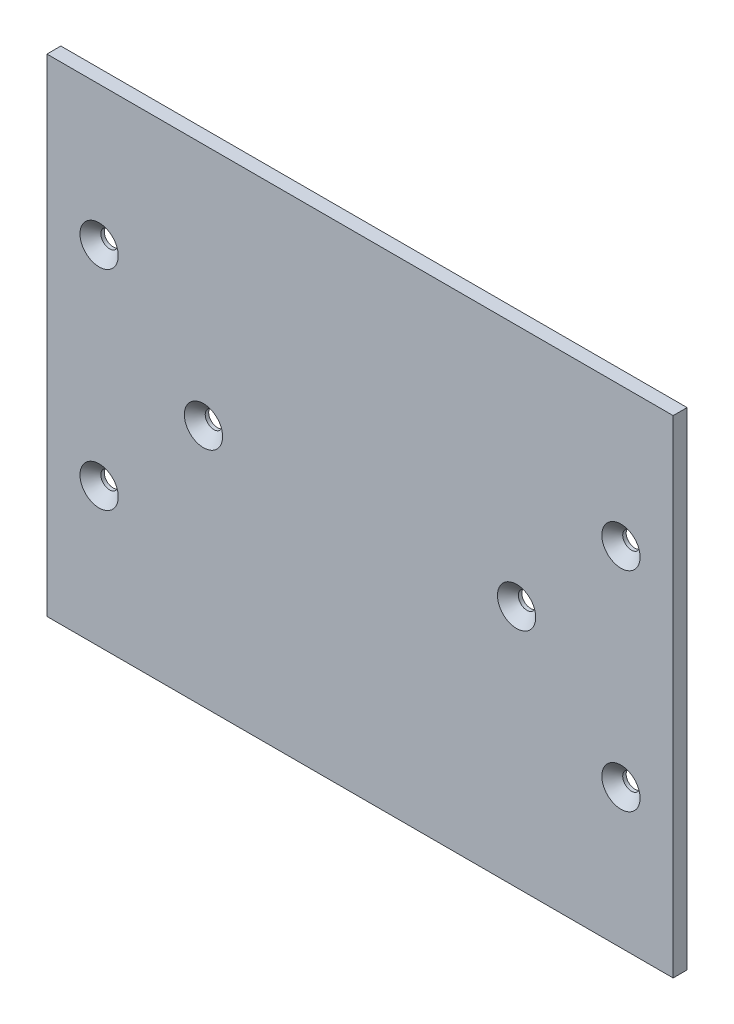
ISO-10303-21;
HEADER;
FILE_DESCRIPTION(('STEP AP214'),'2;1');
FILE_NAME('part.step','',(''),(''),'','','');
FILE_SCHEMA(('AUTOMOTIVE_DESIGN { 1 0 10303 214 1 1 1 1 }'));
ENDSEC;
DATA;
#1=APPLICATION_CONTEXT('core data for automotive mechanical design processes');
#2=APPLICATION_PROTOCOL_DEFINITION('international standard','automotive_design',2000,#1);
#3=PRODUCT_CONTEXT('',#1,'mechanical');
#4=PRODUCT('Part','Part','',(#3));
#5=PRODUCT_RELATED_PRODUCT_CATEGORY('part','',(#4));
#6=PRODUCT_DEFINITION_FORMATION('','',#4);
#7=PRODUCT_DEFINITION_CONTEXT('part definition',#1,'design');
#8=PRODUCT_DEFINITION('design','',#6,#7);
#9=PRODUCT_DEFINITION_SHAPE('','',#8);
#10=(LENGTH_UNIT() NAMED_UNIT(*) SI_UNIT(.MILLI.,.METRE.));
#11=(NAMED_UNIT(*) PLANE_ANGLE_UNIT() SI_UNIT($,.RADIAN.));
#12=(NAMED_UNIT(*) SI_UNIT($,.STERADIAN.) SOLID_ANGLE_UNIT());
#13=UNCERTAINTY_MEASURE_WITH_UNIT(LENGTH_MEASURE(1.E-05),#10,'distance_accuracy_value','');
#14=(GEOMETRIC_REPRESENTATION_CONTEXT(3) GLOBAL_UNCERTAINTY_ASSIGNED_CONTEXT((#13)) GLOBAL_UNIT_ASSIGNED_CONTEXT((#10,
#11,#12)) REPRESENTATION_CONTEXT('',''));
#15=CARTESIAN_POINT('',(0.,0.,0.));
#16=DIRECTION('',(0.,0.,1.));
#17=DIRECTION('',(1.,0.,0.));
#18=AXIS2_PLACEMENT_3D('',#15,#16,#17);
#19=CARTESIAN_POINT('',(-90.,70.,4.));
#20=DIRECTION('',(1.,0.,0.));
#21=DIRECTION('',(0.,1.,0.));
#22=AXIS2_PLACEMENT_3D('',#19,#20,#21);
#23=PLANE('',#22);
#24=DIRECTION('',(0.,-1.,0.));
#25=VECTOR('',#24,1.);
#26=CARTESIAN_POINT('',(-90.,70.,0.));
#27=LINE('',#26,#25);
#28=CARTESIAN_POINT('',(-90.,70.,0.));
#29=VERTEX_POINT('',#28);
#30=CARTESIAN_POINT('',(-90.,-70.,0.));
#31=VERTEX_POINT('',#30);
#32=EDGE_CURVE('E107',#29,#31,#27,.T.);
#33=ORIENTED_EDGE('',*,*,#32,.T.);
#34=DIRECTION('',(0.,0.,-1.));
#35=VECTOR('',#34,1.);
#36=CARTESIAN_POINT('',(-90.,-70.,4.));
#37=LINE('',#36,#35);
#38=CARTESIAN_POINT('',(-90.,-70.,4.));
#39=VERTEX_POINT('',#38);
#40=EDGE_CURVE('E98',#39,#31,#37,.T.);
#41=ORIENTED_EDGE('',*,*,#40,.F.);
#42=DIRECTION('',(0.,-1.,0.));
#43=VECTOR('',#42,1.);
#44=CARTESIAN_POINT('',(-90.,70.,4.));
#45=LINE('',#44,#43);
#46=CARTESIAN_POINT('',(-90.,70.,4.));
#47=VERTEX_POINT('',#46);
#48=EDGE_CURVE('E92',#47,#39,#45,.T.);
#49=ORIENTED_EDGE('',*,*,#48,.F.);
#50=DIRECTION('',(0.,0.,-1.));
#51=VECTOR('',#50,1.);
#52=CARTESIAN_POINT('',(-90.,70.,4.));
#53=LINE('',#52,#51);
#54=EDGE_CURVE('E103',#47,#29,#53,.T.);
#55=ORIENTED_EDGE('',*,*,#54,.T.);
#56=EDGE_LOOP('',(#33,#41,#49,#55));
#57=FACE_BOUND('',#56,.T.);
#58=ADVANCED_FACE('F39',(#57),#23,.F.);
#59=CARTESIAN_POINT('',(-90.,-70.,4.));
#60=DIRECTION('',(0.,1.,0.));
#61=DIRECTION('',(-1.,0.,0.));
#62=AXIS2_PLACEMENT_3D('',#59,#60,#61);
#63=PLANE('',#62);
#64=DIRECTION('',(1.,0.,0.));
#65=VECTOR('',#64,1.);
#66=CARTESIAN_POINT('',(-90.,-70.,0.));
#67=LINE('',#66,#65);
#68=CARTESIAN_POINT('',(90.,-70.,0.));
#69=VERTEX_POINT('',#68);
#70=EDGE_CURVE('E97',#31,#69,#67,.T.);
#71=ORIENTED_EDGE('',*,*,#70,.T.);
#72=DIRECTION('',(0.,0.,-1.));
#73=VECTOR('',#72,1.);
#74=CARTESIAN_POINT('',(90.,-70.,4.));
#75=LINE('',#74,#73);
#76=CARTESIAN_POINT('',(90.,-70.,4.));
#77=VERTEX_POINT('',#76);
#78=EDGE_CURVE('E95',#77,#69,#75,.T.);
#79=ORIENTED_EDGE('',*,*,#78,.F.);
#80=DIRECTION('',(1.,0.,0.));
#81=VECTOR('',#80,1.);
#82=CARTESIAN_POINT('',(-90.,-70.,4.));
#83=LINE('',#82,#81);
#84=EDGE_CURVE('E87',#39,#77,#83,.T.);
#85=ORIENTED_EDGE('',*,*,#84,.F.);
#86=ORIENTED_EDGE('',*,*,#40,.T.);
#87=EDGE_LOOP('',(#71,#79,#85,#86));
#88=FACE_BOUND('',#87,.T.);
#89=ADVANCED_FACE('F96',(#88),#63,.F.);
#90=CARTESIAN_POINT('',(90.,70.,4.));
#91=DIRECTION('',(-1.,0.,0.));
#92=DIRECTION('',(0.,-1.,0.));
#93=AXIS2_PLACEMENT_3D('',#90,#91,#92);
#94=PLANE('',#93);
#95=DIRECTION('',(0.,1.,0.));
#96=VECTOR('',#95,1.);
#97=CARTESIAN_POINT('',(90.,70.,0.));
#98=LINE('',#97,#96);
#99=CARTESIAN_POINT('',(90.,70.,0.));
#100=VERTEX_POINT('',#99);
#101=EDGE_CURVE('E73',#69,#100,#98,.T.);
#102=ORIENTED_EDGE('',*,*,#101,.T.);
#103=DIRECTION('',(0.,0.,-1.));
#104=VECTOR('',#103,1.);
#105=CARTESIAN_POINT('',(90.,70.,4.));
#106=LINE('',#105,#104);
#107=CARTESIAN_POINT('',(90.,70.,4.));
#108=VERTEX_POINT('',#107);
#109=EDGE_CURVE('E99',#108,#100,#106,.T.);
#110=ORIENTED_EDGE('',*,*,#109,.F.);
#111=DIRECTION('',(0.,1.,0.));
#112=VECTOR('',#111,1.);
#113=CARTESIAN_POINT('',(90.,70.,4.));
#114=LINE('',#113,#112);
#115=EDGE_CURVE('E90',#77,#108,#114,.T.);
#116=ORIENTED_EDGE('',*,*,#115,.F.);
#117=ORIENTED_EDGE('',*,*,#78,.T.);
#118=EDGE_LOOP('',(#102,#110,#116,#117));
#119=FACE_BOUND('',#118,.T.);
#120=ADVANCED_FACE('F101',(#119),#94,.F.);
#121=CARTESIAN_POINT('',(-90.,70.,4.));
#122=DIRECTION('',(0.,-1.,0.));
#123=DIRECTION('',(1.,0.,0.));
#124=AXIS2_PLACEMENT_3D('',#121,#122,#123);
#125=PLANE('',#124);
#126=DIRECTION('',(-1.,0.,0.));
#127=VECTOR('',#126,1.);
#128=CARTESIAN_POINT('',(-90.,70.,0.));
#129=LINE('',#128,#127);
#130=EDGE_CURVE('E79',#100,#29,#129,.T.);
#131=ORIENTED_EDGE('',*,*,#130,.T.);
#132=ORIENTED_EDGE('',*,*,#54,.F.);
#133=DIRECTION('',(-1.,0.,0.));
#134=VECTOR('',#133,1.);
#135=CARTESIAN_POINT('',(-90.,70.,4.));
#136=LINE('',#135,#134);
#137=EDGE_CURVE('E56',#108,#47,#136,.T.);
#138=ORIENTED_EDGE('',*,*,#137,.F.);
#139=ORIENTED_EDGE('',*,*,#109,.T.);
#140=EDGE_LOOP('',(#131,#132,#138,#139));
#141=FACE_BOUND('',#140,.T.);
#142=ADVANCED_FACE('F161',(#141),#125,.F.);
#143=CARTESIAN_POINT('',(0.,0.,4.));
#144=DIRECTION('',(0.,0.,1.));
#145=DIRECTION('',(1.,0.,0.));
#146=AXIS2_PLACEMENT_3D('',#143,#144,#145);
#147=PLANE('',#146);
#148=CARTESIAN_POINT('',(-45.,0.,4.));
#149=DIRECTION('',(0.,0.,1.));
#150=DIRECTION('',(1.,0.,0.));
#151=AXIS2_PLACEMENT_3D('',#148,#149,#150);
#152=CIRCLE('',#151,5.50000000000003);
#153=CARTESIAN_POINT('',(-39.5,0.,4.));
#154=VERTEX_POINT('',#153);
#155=EDGE_CURVE('E132',#154,#154,#152,.F.);
#156=ORIENTED_EDGE('',*,*,#155,.T.);
#157=EDGE_LOOP('',(#156));
#158=FACE_BOUND('',#157,.T.);
#159=CARTESIAN_POINT('',(45.,0.,4.));
#160=DIRECTION('',(0.,0.,1.));
#161=DIRECTION('',(1.,0.,0.));
#162=AXIS2_PLACEMENT_3D('',#159,#160,#161);
#163=CIRCLE('',#162,5.50000000000003);
#164=CARTESIAN_POINT('',(50.5000000000001,0.,4.));
#165=VERTEX_POINT('',#164);
#166=EDGE_CURVE('E129',#165,#165,#163,.F.);
#167=ORIENTED_EDGE('',*,*,#166,.T.);
#168=EDGE_LOOP('',(#167));
#169=FACE_BOUND('',#168,.T.);
#170=CARTESIAN_POINT('',(-75.,30.,4.));
#171=DIRECTION('',(0.,0.,1.));
#172=DIRECTION('',(1.,0.,0.));
#173=AXIS2_PLACEMENT_3D('',#170,#171,#172);
#174=CIRCLE('',#173,5.50000000000003);
#175=CARTESIAN_POINT('',(-69.5,30.,4.));
#176=VERTEX_POINT('',#175);
#177=EDGE_CURVE('E126',#176,#176,#174,.F.);
#178=ORIENTED_EDGE('',*,*,#177,.T.);
#179=EDGE_LOOP('',(#178));
#180=FACE_BOUND('',#179,.T.);
#181=CARTESIAN_POINT('',(-75.,-30.,4.));
#182=DIRECTION('',(0.,0.,1.));
#183=DIRECTION('',(1.,0.,0.));
#184=AXIS2_PLACEMENT_3D('',#181,#182,#183);
#185=CIRCLE('',#184,5.50000000000003);
#186=CARTESIAN_POINT('',(-69.5,-30.,4.));
#187=VERTEX_POINT('',#186);
#188=EDGE_CURVE('E123',#187,#187,#185,.F.);
#189=ORIENTED_EDGE('',*,*,#188,.T.);
#190=EDGE_LOOP('',(#189));
#191=FACE_BOUND('',#190,.T.);
#192=CARTESIAN_POINT('',(75.,-30.,4.));
#193=DIRECTION('',(0.,0.,1.));
#194=DIRECTION('',(1.,0.,0.));
#195=AXIS2_PLACEMENT_3D('',#192,#193,#194);
#196=CIRCLE('',#195,5.50000000000003);
#197=CARTESIAN_POINT('',(80.5000000000001,-30.,4.));
#198=VERTEX_POINT('',#197);
#199=EDGE_CURVE('E120',#198,#198,#196,.F.);
#200=ORIENTED_EDGE('',*,*,#199,.T.);
#201=EDGE_LOOP('',(#200));
#202=FACE_BOUND('',#201,.T.);
#203=CARTESIAN_POINT('',(75.0000000000001,30.,4.));
#204=DIRECTION('',(0.,0.,1.));
#205=DIRECTION('',(1.,0.,0.));
#206=AXIS2_PLACEMENT_3D('',#203,#204,#205);
#207=CIRCLE('',#206,5.50000000000003);
#208=CARTESIAN_POINT('',(80.5000000000001,30.,4.));
#209=VERTEX_POINT('',#208);
#210=EDGE_CURVE('E117',#209,#209,#207,.F.);
#211=ORIENTED_EDGE('',*,*,#210,.T.);
#212=EDGE_LOOP('',(#211));
#213=FACE_BOUND('',#212,.T.);
#214=ORIENTED_EDGE('',*,*,#48,.T.);
#215=ORIENTED_EDGE('',*,*,#84,.T.);
#216=ORIENTED_EDGE('',*,*,#115,.T.);
#217=ORIENTED_EDGE('',*,*,#137,.T.);
#218=EDGE_LOOP('',(#214,#215,#216,#217));
#219=FACE_BOUND('',#218,.T.);
#220=ADVANCED_FACE('F88',(#158,#169,#180,#191,#202,#213,#219),#147,.T.);
#221=CARTESIAN_POINT('',(0.,0.,0.));
#222=DIRECTION('',(0.,0.,1.));
#223=DIRECTION('',(1.,0.,0.));
#224=AXIS2_PLACEMENT_3D('',#221,#222,#223);
#225=PLANE('',#224);
#226=CARTESIAN_POINT('',(75.,-30.,0.));
#227=DIRECTION('',(0.,0.,-1.));
#228=DIRECTION('',(-1.,0.,0.));
#229=AXIS2_PLACEMENT_3D('',#226,#227,#228);
#230=CIRCLE('',#229,2.50000000000001);
#231=CARTESIAN_POINT('',(72.5,-30.,0.));
#232=VERTEX_POINT('',#231);
#233=EDGE_CURVE('E210',#232,#232,#230,.T.);
#234=ORIENTED_EDGE('',*,*,#233,.F.);
#235=EDGE_LOOP('',(#234));
#236=FACE_BOUND('',#235,.T.);
#237=CARTESIAN_POINT('',(-75.,-30.,0.));
#238=DIRECTION('',(0.,0.,-1.));
#239=DIRECTION('',(-1.,0.,0.));
#240=AXIS2_PLACEMENT_3D('',#237,#238,#239);
#241=CIRCLE('',#240,2.50000000000001);
#242=CARTESIAN_POINT('',(-77.5,-30.,0.));
#243=VERTEX_POINT('',#242);
#244=EDGE_CURVE('E208',#243,#243,#241,.T.);
#245=ORIENTED_EDGE('',*,*,#244,.F.);
#246=EDGE_LOOP('',(#245));
#247=FACE_BOUND('',#246,.T.);
#248=CARTESIAN_POINT('',(-75.,30.,0.));
#249=DIRECTION('',(0.,0.,-1.));
#250=DIRECTION('',(-1.,0.,0.));
#251=AXIS2_PLACEMENT_3D('',#248,#249,#250);
#252=CIRCLE('',#251,2.50000000000001);
#253=CARTESIAN_POINT('',(-77.5,30.,0.));
#254=VERTEX_POINT('',#253);
#255=EDGE_CURVE('E211',#254,#254,#252,.T.);
#256=ORIENTED_EDGE('',*,*,#255,.F.);
#257=EDGE_LOOP('',(#256));
#258=FACE_BOUND('',#257,.T.);
#259=CARTESIAN_POINT('',(-45.,0.,0.));
#260=DIRECTION('',(0.,0.,-1.));
#261=DIRECTION('',(-1.,0.,0.));
#262=AXIS2_PLACEMENT_3D('',#259,#260,#261);
#263=CIRCLE('',#262,2.5);
#264=CARTESIAN_POINT('',(-47.5,0.,0.));
#265=VERTEX_POINT('',#264);
#266=EDGE_CURVE('E216',#265,#265,#263,.T.);
#267=ORIENTED_EDGE('',*,*,#266,.F.);
#268=EDGE_LOOP('',(#267));
#269=FACE_BOUND('',#268,.T.);
#270=CARTESIAN_POINT('',(45.,0.,0.));
#271=DIRECTION('',(0.,0.,-1.));
#272=DIRECTION('',(-1.,0.,0.));
#273=AXIS2_PLACEMENT_3D('',#270,#271,#272);
#274=CIRCLE('',#273,2.5);
#275=CARTESIAN_POINT('',(42.5,0.,0.));
#276=VERTEX_POINT('',#275);
#277=EDGE_CURVE('E221',#276,#276,#274,.T.);
#278=ORIENTED_EDGE('',*,*,#277,.F.);
#279=EDGE_LOOP('',(#278));
#280=FACE_BOUND('',#279,.T.);
#281=CARTESIAN_POINT('',(75.0000000000001,30.,0.));
#282=DIRECTION('',(0.,0.,-1.));
#283=DIRECTION('',(-1.,0.,0.));
#284=AXIS2_PLACEMENT_3D('',#281,#282,#283);
#285=CIRCLE('',#284,2.50000000000001);
#286=CARTESIAN_POINT('',(72.5,30.,0.));
#287=VERTEX_POINT('',#286);
#288=EDGE_CURVE('E110',#287,#287,#285,.T.);
#289=ORIENTED_EDGE('',*,*,#288,.F.);
#290=EDGE_LOOP('',(#289));
#291=FACE_BOUND('',#290,.T.);
#292=ORIENTED_EDGE('',*,*,#32,.F.);
#293=ORIENTED_EDGE('',*,*,#130,.F.);
#294=ORIENTED_EDGE('',*,*,#101,.F.);
#295=ORIENTED_EDGE('',*,*,#70,.F.);
#296=EDGE_LOOP('',(#292,#293,#294,#295));
#297=FACE_BOUND('',#296,.T.);
#298=ADVANCED_FACE('F160',(#236,#247,#258,#269,#280,#291,#297),#225,.F.);
#299=CARTESIAN_POINT('',(75.0000000000001,30.,4.001));
#300=DIRECTION('',(0.,0.,-1.));
#301=DIRECTION('',(-1.,0.,0.));
#302=AXIS2_PLACEMENT_3D('',#299,#300,#301);
#303=CYLINDRICAL_SURFACE('',#302,2.50000000000001);
#304=CARTESIAN_POINT('',(75.0000000000001,30.,0.999999999999964));
#305=DIRECTION('',(0.,0.,1.));
#306=DIRECTION('',(1.,0.,0.));
#307=AXIS2_PLACEMENT_3D('',#304,#305,#306);
#308=CIRCLE('',#307,2.50000000000001);
#309=CARTESIAN_POINT('',(77.5000000000001,30.,0.999999999999964));
#310=VERTEX_POINT('',#309);
#311=EDGE_CURVE('E11',#310,#310,#308,.T.);
#312=ORIENTED_EDGE('',*,*,#311,.T.);
#313=EDGE_LOOP('',(#312));
#314=FACE_BOUND('',#313,.T.);
#315=ORIENTED_EDGE('',*,*,#288,.T.);
#316=EDGE_LOOP('',(#315));
#317=FACE_BOUND('',#316,.T.);
#318=ADVANCED_FACE('F227',(#314,#317),#303,.F.);
#319=CARTESIAN_POINT('',(45.,0.,4.001));
#320=DIRECTION('',(0.,0.,-1.));
#321=DIRECTION('',(-1.,0.,0.));
#322=AXIS2_PLACEMENT_3D('',#319,#320,#321);
#323=CYLINDRICAL_SURFACE('',#322,2.5);
#324=CARTESIAN_POINT('',(45.,0.,0.999999999999956));
#325=DIRECTION('',(0.,0.,1.));
#326=DIRECTION('',(1.,0.,0.));
#327=AXIS2_PLACEMENT_3D('',#324,#325,#326);
#328=CIRCLE('',#327,2.5);
#329=CARTESIAN_POINT('',(47.5,0.,0.999999999999956));
#330=VERTEX_POINT('',#329);
#331=EDGE_CURVE('E138',#330,#330,#328,.T.);
#332=ORIENTED_EDGE('',*,*,#331,.T.);
#333=EDGE_LOOP('',(#332));
#334=FACE_BOUND('',#333,.T.);
#335=ORIENTED_EDGE('',*,*,#277,.T.);
#336=EDGE_LOOP('',(#335));
#337=FACE_BOUND('',#336,.T.);
#338=ADVANCED_FACE('F242',(#334,#337),#323,.F.);
#339=CARTESIAN_POINT('',(-45.,0.,4.001));
#340=DIRECTION('',(0.,0.,-1.));
#341=DIRECTION('',(-1.,0.,0.));
#342=AXIS2_PLACEMENT_3D('',#339,#340,#341);
#343=CYLINDRICAL_SURFACE('',#342,2.5);
#344=CARTESIAN_POINT('',(-45.,0.,0.999999999999956));
#345=DIRECTION('',(0.,0.,1.));
#346=DIRECTION('',(1.,0.,0.));
#347=AXIS2_PLACEMENT_3D('',#344,#345,#346);
#348=CIRCLE('',#347,2.5);
#349=CARTESIAN_POINT('',(-42.5,0.,0.999999999999956));
#350=VERTEX_POINT('',#349);
#351=EDGE_CURVE('E135',#350,#350,#348,.T.);
#352=ORIENTED_EDGE('',*,*,#351,.T.);
#353=EDGE_LOOP('',(#352));
#354=FACE_BOUND('',#353,.T.);
#355=ORIENTED_EDGE('',*,*,#266,.T.);
#356=EDGE_LOOP('',(#355));
#357=FACE_BOUND('',#356,.T.);
#358=ADVANCED_FACE('F246',(#354,#357),#343,.F.);
#359=CARTESIAN_POINT('',(-75.,30.,4.001));
#360=DIRECTION('',(0.,0.,-1.));
#361=DIRECTION('',(-1.,0.,0.));
#362=AXIS2_PLACEMENT_3D('',#359,#360,#361);
#363=CYLINDRICAL_SURFACE('',#362,2.50000000000001);
#364=CARTESIAN_POINT('',(-75.,30.,0.999999999999964));
#365=DIRECTION('',(0.,0.,1.));
#366=DIRECTION('',(1.,0.,0.));
#367=AXIS2_PLACEMENT_3D('',#364,#365,#366);
#368=CIRCLE('',#367,2.50000000000001);
#369=CARTESIAN_POINT('',(-72.5,30.,0.999999999999964));
#370=VERTEX_POINT('',#369);
#371=EDGE_CURVE('E141',#370,#370,#368,.T.);
#372=ORIENTED_EDGE('',*,*,#371,.T.);
#373=EDGE_LOOP('',(#372));
#374=FACE_BOUND('',#373,.T.);
#375=ORIENTED_EDGE('',*,*,#255,.T.);
#376=EDGE_LOOP('',(#375));
#377=FACE_BOUND('',#376,.T.);
#378=ADVANCED_FACE('F204',(#374,#377),#363,.F.);
#379=CARTESIAN_POINT('',(-75.,-30.,4.001));
#380=DIRECTION('',(0.,0.,-1.));
#381=DIRECTION('',(-1.,0.,0.));
#382=AXIS2_PLACEMENT_3D('',#379,#380,#381);
#383=CYLINDRICAL_SURFACE('',#382,2.50000000000001);
#384=CARTESIAN_POINT('',(-75.,-30.,0.999999999999964));
#385=DIRECTION('',(0.,0.,1.));
#386=DIRECTION('',(1.,0.,0.));
#387=AXIS2_PLACEMENT_3D('',#384,#385,#386);
#388=CIRCLE('',#387,2.50000000000001);
#389=CARTESIAN_POINT('',(-72.5,-30.,0.999999999999964));
#390=VERTEX_POINT('',#389);
#391=EDGE_CURVE('E144',#390,#390,#388,.T.);
#392=ORIENTED_EDGE('',*,*,#391,.T.);
#393=EDGE_LOOP('',(#392));
#394=FACE_BOUND('',#393,.T.);
#395=ORIENTED_EDGE('',*,*,#244,.T.);
#396=EDGE_LOOP('',(#395));
#397=FACE_BOUND('',#396,.T.);
#398=ADVANCED_FACE('F201',(#394,#397),#383,.F.);
#399=CARTESIAN_POINT('',(75.,-30.,4.001));
#400=DIRECTION('',(0.,0.,-1.));
#401=DIRECTION('',(-1.,0.,0.));
#402=AXIS2_PLACEMENT_3D('',#399,#400,#401);
#403=CYLINDRICAL_SURFACE('',#402,2.50000000000001);
#404=CARTESIAN_POINT('',(75.,-30.,0.999999999999964));
#405=DIRECTION('',(0.,0.,1.));
#406=DIRECTION('',(1.,0.,0.));
#407=AXIS2_PLACEMENT_3D('',#404,#405,#406);
#408=CIRCLE('',#407,2.50000000000001);
#409=CARTESIAN_POINT('',(77.5,-30.,0.999999999999964));
#410=VERTEX_POINT('',#409);
#411=EDGE_CURVE('E48',#410,#410,#408,.T.);
#412=ORIENTED_EDGE('',*,*,#411,.T.);
#413=EDGE_LOOP('',(#412));
#414=FACE_BOUND('',#413,.T.);
#415=ORIENTED_EDGE('',*,*,#233,.T.);
#416=EDGE_LOOP('',(#415));
#417=FACE_BOUND('',#416,.T.);
#418=ADVANCED_FACE('F149',(#414,#417),#403,.F.);
#419=CARTESIAN_POINT('',(-45.,0.,4.));
#420=DIRECTION('',(0.,0.,1.));
#421=DIRECTION('',(1.,0.,0.));
#422=AXIS2_PLACEMENT_3D('',#419,#420,#421);
#423=CONICAL_SURFACE('',#422,5.50000000000003,0.785398163397446);
#424=ORIENTED_EDGE('',*,*,#351,.F.);
#425=EDGE_LOOP('',(#424));
#426=FACE_BOUND('',#425,.T.);
#427=ORIENTED_EDGE('',*,*,#155,.F.);
#428=EDGE_LOOP('',(#427));
#429=FACE_BOUND('',#428,.T.);
#430=ADVANCED_FACE('F180',(#426,#429),#423,.F.);
#431=CARTESIAN_POINT('',(45.,0.,4.));
#432=DIRECTION('',(0.,0.,1.));
#433=DIRECTION('',(1.,0.,0.));
#434=AXIS2_PLACEMENT_3D('',#431,#432,#433);
#435=CONICAL_SURFACE('',#434,5.50000000000003,0.785398163397446);
#436=ORIENTED_EDGE('',*,*,#331,.F.);
#437=EDGE_LOOP('',(#436));
#438=FACE_BOUND('',#437,.T.);
#439=ORIENTED_EDGE('',*,*,#166,.F.);
#440=EDGE_LOOP('',(#439));
#441=FACE_BOUND('',#440,.T.);
#442=ADVANCED_FACE('F183',(#438,#441),#435,.F.);
#443=CARTESIAN_POINT('',(-75.,30.,4.));
#444=DIRECTION('',(0.,0.,1.));
#445=DIRECTION('',(1.,0.,0.));
#446=AXIS2_PLACEMENT_3D('',#443,#444,#445);
#447=CONICAL_SURFACE('',#446,5.50000000000003,0.785398163397446);
#448=ORIENTED_EDGE('',*,*,#371,.F.);
#449=EDGE_LOOP('',(#448));
#450=FACE_BOUND('',#449,.T.);
#451=ORIENTED_EDGE('',*,*,#177,.F.);
#452=EDGE_LOOP('',(#451));
#453=FACE_BOUND('',#452,.T.);
#454=ADVANCED_FACE('F187',(#450,#453),#447,.F.);
#455=CARTESIAN_POINT('',(-75.,-30.,4.));
#456=DIRECTION('',(0.,0.,1.));
#457=DIRECTION('',(1.,0.,0.));
#458=AXIS2_PLACEMENT_3D('',#455,#456,#457);
#459=CONICAL_SURFACE('',#458,5.50000000000003,0.785398163397446);
#460=ORIENTED_EDGE('',*,*,#391,.F.);
#461=EDGE_LOOP('',(#460));
#462=FACE_BOUND('',#461,.T.);
#463=ORIENTED_EDGE('',*,*,#188,.F.);
#464=EDGE_LOOP('',(#463));
#465=FACE_BOUND('',#464,.T.);
#466=ADVANCED_FACE('F155',(#462,#465),#459,.F.);
#467=CARTESIAN_POINT('',(75.,-30.,4.));
#468=DIRECTION('',(0.,0.,1.));
#469=DIRECTION('',(1.,0.,0.));
#470=AXIS2_PLACEMENT_3D('',#467,#468,#469);
#471=CONICAL_SURFACE('',#470,5.50000000000003,0.785398163397446);
#472=ORIENTED_EDGE('',*,*,#411,.F.);
#473=EDGE_LOOP('',(#472));
#474=FACE_BOUND('',#473,.T.);
#475=ORIENTED_EDGE('',*,*,#199,.F.);
#476=EDGE_LOOP('',(#475));
#477=FACE_BOUND('',#476,.T.);
#478=ADVANCED_FACE('F152',(#474,#477),#471,.F.);
#479=CARTESIAN_POINT('',(75.0000000000001,30.,4.));
#480=DIRECTION('',(0.,0.,1.));
#481=DIRECTION('',(1.,0.,0.));
#482=AXIS2_PLACEMENT_3D('',#479,#480,#481);
#483=CONICAL_SURFACE('',#482,5.50000000000003,0.785398163397446);
#484=ORIENTED_EDGE('',*,*,#311,.F.);
#485=EDGE_LOOP('',(#484));
#486=FACE_BOUND('',#485,.T.);
#487=ORIENTED_EDGE('',*,*,#210,.F.);
#488=EDGE_LOOP('',(#487));
#489=FACE_BOUND('',#488,.T.);
#490=ADVANCED_FACE('F41',(#486,#489),#483,.F.);
#491=CLOSED_SHELL('',(#58,#89,#120,#142,#220,#298,#318,#338,#358,#378,#398,#418,#430,#442,#454,
#466,#478,#490));
#492=MANIFOLD_SOLID_BREP('B2',#491);
#493=ADVANCED_BREP_SHAPE_REPRESENTATION('',(#18,#492),#14);
#494=SHAPE_DEFINITION_REPRESENTATION(#9,#493);
ENDSEC;
END-ISO-10303-21;
